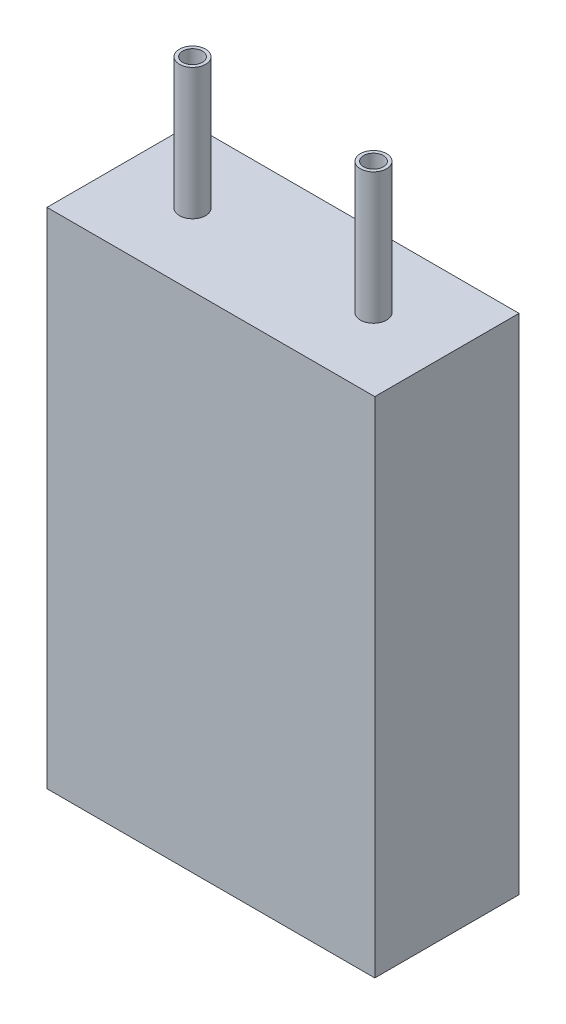
ISO-10303-21;
HEADER;
FILE_DESCRIPTION(('STEP AP214'),'2;1');
FILE_NAME('part.step','',(''),(''),'','','');
FILE_SCHEMA(('AUTOMOTIVE_DESIGN { 1 0 10303 214 1 1 1 1 }'));
ENDSEC;
DATA;
#1=APPLICATION_CONTEXT('core data for automotive mechanical design processes');
#2=APPLICATION_PROTOCOL_DEFINITION('international standard','automotive_design',2000,#1);
#3=PRODUCT_CONTEXT('',#1,'mechanical');
#4=PRODUCT('Part','Part','',(#3));
#5=PRODUCT_RELATED_PRODUCT_CATEGORY('part','',(#4));
#6=PRODUCT_DEFINITION_FORMATION('','',#4);
#7=PRODUCT_DEFINITION_CONTEXT('part definition',#1,'design');
#8=PRODUCT_DEFINITION('design','',#6,#7);
#9=PRODUCT_DEFINITION_SHAPE('','',#8);
#10=(LENGTH_UNIT() NAMED_UNIT(*) SI_UNIT(.MILLI.,.METRE.));
#11=(NAMED_UNIT(*) PLANE_ANGLE_UNIT() SI_UNIT($,.RADIAN.));
#12=(NAMED_UNIT(*) SI_UNIT($,.STERADIAN.) SOLID_ANGLE_UNIT());
#13=UNCERTAINTY_MEASURE_WITH_UNIT(LENGTH_MEASURE(1.E-05),#10,'distance_accuracy_value','');
#14=(GEOMETRIC_REPRESENTATION_CONTEXT(3) GLOBAL_UNCERTAINTY_ASSIGNED_CONTEXT((#13)) GLOBAL_UNIT_ASSIGNED_CONTEXT((#10,
#11,#12)) REPRESENTATION_CONTEXT('',''));
#15=CARTESIAN_POINT('',(0.,0.,0.));
#16=DIRECTION('',(0.,0.,1.));
#17=DIRECTION('',(1.,0.,0.));
#18=AXIS2_PLACEMENT_3D('',#15,#16,#17);
#19=CARTESIAN_POINT('',(0.,97.536,0.));
#20=DIRECTION('',(1.,0.,0.));
#21=DIRECTION('',(0.,0.,-1.));
#22=AXIS2_PLACEMENT_3D('',#19,#20,#21);
#23=PLANE('',#22);
#24=DIRECTION('',(0.,0.,1.));
#25=VECTOR('',#24,1.);
#26=CARTESIAN_POINT('',(0.,0.,0.));
#27=LINE('',#26,#25);
#28=CARTESIAN_POINT('',(0.,0.,0.));
#29=VERTEX_POINT('',#28);
#30=CARTESIAN_POINT('',(0.,0.,27.94));
#31=VERTEX_POINT('',#30);
#32=EDGE_CURVE('E111',#29,#31,#27,.T.);
#33=ORIENTED_EDGE('',*,*,#32,.T.);
#34=DIRECTION('',(0.,-1.,0.));
#35=VECTOR('',#34,1.);
#36=CARTESIAN_POINT('',(0.,97.536,27.94));
#37=LINE('',#36,#35);
#38=CARTESIAN_POINT('',(0.,97.536,27.94));
#39=VERTEX_POINT('',#38);
#40=EDGE_CURVE('E100',#39,#31,#37,.T.);
#41=ORIENTED_EDGE('',*,*,#40,.F.);
#42=DIRECTION('',(0.,0.,1.));
#43=VECTOR('',#42,1.);
#44=CARTESIAN_POINT('',(0.,97.536,0.));
#45=LINE('',#44,#43);
#46=CARTESIAN_POINT('',(0.,97.536,0.));
#47=VERTEX_POINT('',#46);
#48=EDGE_CURVE('E92',#47,#39,#45,.T.);
#49=ORIENTED_EDGE('',*,*,#48,.F.);
#50=DIRECTION('',(0.,-1.,0.));
#51=VECTOR('',#50,1.);
#52=CARTESIAN_POINT('',(0.,97.536,0.));
#53=LINE('',#52,#51);
#54=EDGE_CURVE('E107',#47,#29,#53,.T.);
#55=ORIENTED_EDGE('',*,*,#54,.T.);
#56=EDGE_LOOP('',(#33,#41,#49,#55));
#57=FACE_BOUND('',#56,.T.);
#58=ADVANCED_FACE('F39',(#57),#23,.F.);
#59=CARTESIAN_POINT('',(0.,97.536,27.94));
#60=DIRECTION('',(0.,0.,-1.));
#61=DIRECTION('',(-1.,0.,0.));
#62=AXIS2_PLACEMENT_3D('',#59,#60,#61);
#63=PLANE('',#62);
#64=DIRECTION('',(1.,0.,0.));
#65=VECTOR('',#64,1.);
#66=CARTESIAN_POINT('',(0.,0.,27.94));
#67=LINE('',#66,#65);
#68=CARTESIAN_POINT('',(63.5,0.,27.94));
#69=VERTEX_POINT('',#68);
#70=EDGE_CURVE('E98',#31,#69,#67,.T.);
#71=ORIENTED_EDGE('',*,*,#70,.T.);
#72=DIRECTION('',(0.,-1.,0.));
#73=VECTOR('',#72,1.);
#74=CARTESIAN_POINT('',(63.5,97.536,27.94));
#75=LINE('',#74,#73);
#76=CARTESIAN_POINT('',(63.5,97.536,27.94));
#77=VERTEX_POINT('',#76);
#78=EDGE_CURVE('E96',#77,#69,#75,.T.);
#79=ORIENTED_EDGE('',*,*,#78,.F.);
#80=DIRECTION('',(1.,0.,0.));
#81=VECTOR('',#80,1.);
#82=CARTESIAN_POINT('',(0.,97.536,27.94));
#83=LINE('',#82,#81);
#84=EDGE_CURVE('E87',#39,#77,#83,.T.);
#85=ORIENTED_EDGE('',*,*,#84,.F.);
#86=ORIENTED_EDGE('',*,*,#40,.T.);
#87=EDGE_LOOP('',(#71,#79,#85,#86));
#88=FACE_BOUND('',#87,.T.);
#89=ADVANCED_FACE('F97',(#88),#63,.F.);
#90=CARTESIAN_POINT('',(63.5,97.536,0.));
#91=DIRECTION('',(-1.,0.,0.));
#92=DIRECTION('',(0.,0.,1.));
#93=AXIS2_PLACEMENT_3D('',#90,#91,#92);
#94=PLANE('',#93);
#95=DIRECTION('',(0.,0.,-1.));
#96=VECTOR('',#95,1.);
#97=CARTESIAN_POINT('',(63.5,0.,0.));
#98=LINE('',#97,#96);
#99=CARTESIAN_POINT('',(63.5,0.,0.));
#100=VERTEX_POINT('',#99);
#101=EDGE_CURVE('E73',#69,#100,#98,.T.);
#102=ORIENTED_EDGE('',*,*,#101,.T.);
#103=DIRECTION('',(0.,-1.,0.));
#104=VECTOR('',#103,1.);
#105=CARTESIAN_POINT('',(63.5,97.536,0.));
#106=LINE('',#105,#104);
#107=CARTESIAN_POINT('',(63.5,97.536,0.));
#108=VERTEX_POINT('',#107);
#109=EDGE_CURVE('E101',#108,#100,#106,.T.);
#110=ORIENTED_EDGE('',*,*,#109,.F.);
#111=DIRECTION('',(0.,0.,-1.));
#112=VECTOR('',#111,1.);
#113=CARTESIAN_POINT('',(63.5,97.536,0.));
#114=LINE('',#113,#112);
#115=EDGE_CURVE('E90',#77,#108,#114,.T.);
#116=ORIENTED_EDGE('',*,*,#115,.F.);
#117=ORIENTED_EDGE('',*,*,#78,.T.);
#118=EDGE_LOOP('',(#102,#110,#116,#117));
#119=FACE_BOUND('',#118,.T.);
#120=ADVANCED_FACE('F103',(#119),#94,.F.);
#121=CARTESIAN_POINT('',(0.,97.536,0.));
#122=DIRECTION('',(0.,0.,1.));
#123=DIRECTION('',(1.,0.,0.));
#124=AXIS2_PLACEMENT_3D('',#121,#122,#123);
#125=PLANE('',#124);
#126=DIRECTION('',(-1.,0.,0.));
#127=VECTOR('',#126,1.);
#128=CARTESIAN_POINT('',(0.,0.,0.));
#129=LINE('',#128,#127);
#130=EDGE_CURVE('E79',#100,#29,#129,.T.);
#131=ORIENTED_EDGE('',*,*,#130,.T.);
#132=ORIENTED_EDGE('',*,*,#54,.F.);
#133=DIRECTION('',(-1.,0.,0.));
#134=VECTOR('',#133,1.);
#135=CARTESIAN_POINT('',(0.,97.536,0.));
#136=LINE('',#135,#134);
#137=EDGE_CURVE('E56',#108,#47,#136,.T.);
#138=ORIENTED_EDGE('',*,*,#137,.F.);
#139=ORIENTED_EDGE('',*,*,#109,.T.);
#140=EDGE_LOOP('',(#131,#132,#138,#139));
#141=FACE_BOUND('',#140,.T.);
#142=ADVANCED_FACE('F152',(#141),#125,.F.);
#143=CARTESIAN_POINT('',(0.,97.536,0.));
#144=DIRECTION('',(0.,1.,0.));
#145=DIRECTION('',(0.,0.,1.));
#146=AXIS2_PLACEMENT_3D('',#143,#144,#145);
#147=PLANE('',#146);
#148=CARTESIAN_POINT('',(49.276,97.536,13.97));
#149=DIRECTION('',(0.,1.,0.));
#150=DIRECTION('',(0.,0.,1.));
#151=AXIS2_PLACEMENT_3D('',#148,#149,#150);
#152=CIRCLE('',#151,2.54);
#153=CARTESIAN_POINT('',(49.276,97.536,16.51));
#154=VERTEX_POINT('',#153);
#155=EDGE_CURVE('E254',#154,#154,#152,.T.);
#156=ORIENTED_EDGE('',*,*,#155,.F.);
#157=EDGE_LOOP('',(#156));
#158=FACE_BOUND('',#157,.T.);
#159=CARTESIAN_POINT('',(14.224,97.536,13.97));
#160=DIRECTION('',(0.,1.,0.));
#161=DIRECTION('',(0.,0.,1.));
#162=AXIS2_PLACEMENT_3D('',#159,#160,#161);
#163=CIRCLE('',#162,2.54);
#164=CARTESIAN_POINT('',(14.224,97.536,16.51));
#165=VERTEX_POINT('',#164);
#166=EDGE_CURVE('E268',#165,#165,#163,.T.);
#167=ORIENTED_EDGE('',*,*,#166,.F.);
#168=EDGE_LOOP('',(#167));
#169=FACE_BOUND('',#168,.T.);
#170=ORIENTED_EDGE('',*,*,#48,.T.);
#171=ORIENTED_EDGE('',*,*,#84,.T.);
#172=ORIENTED_EDGE('',*,*,#115,.T.);
#173=ORIENTED_EDGE('',*,*,#137,.T.);
#174=EDGE_LOOP('',(#170,#171,#172,#173));
#175=FACE_BOUND('',#174,.T.);
#176=ADVANCED_FACE('F88',(#158,#169,#175),#147,.T.);
#177=CARTESIAN_POINT('',(0.,0.,0.));
#178=DIRECTION('',(0.,1.,0.));
#179=DIRECTION('',(0.,0.,1.));
#180=AXIS2_PLACEMENT_3D('',#177,#178,#179);
#181=PLANE('',#180);
#182=ORIENTED_EDGE('',*,*,#32,.F.);
#183=ORIENTED_EDGE('',*,*,#130,.F.);
#184=ORIENTED_EDGE('',*,*,#101,.F.);
#185=ORIENTED_EDGE('',*,*,#70,.F.);
#186=EDGE_LOOP('',(#182,#183,#184,#185));
#187=FACE_BOUND('',#186,.T.);
#188=ADVANCED_FACE('F151',(#187),#181,.F.);
#189=CARTESIAN_POINT('',(14.224,122.936,13.97));
#190=DIRECTION('',(0.,1.,0.));
#191=DIRECTION('',(0.,0.,1.));
#192=AXIS2_PLACEMENT_3D('',#189,#190,#191);
#193=PLANE('',#192);
#194=CARTESIAN_POINT('',(14.224,122.936,13.97));
#195=DIRECTION('',(0.,1.,0.));
#196=DIRECTION('',(0.,0.,1.));
#197=AXIS2_PLACEMENT_3D('',#194,#195,#196);
#198=CIRCLE('',#197,2.54);
#199=CARTESIAN_POINT('',(14.224,122.936,16.51));
#200=VERTEX_POINT('',#199);
#201=EDGE_CURVE('E115',#200,#200,#198,.T.);
#202=ORIENTED_EDGE('',*,*,#201,.T.);
#203=EDGE_LOOP('',(#202));
#204=FACE_BOUND('',#203,.T.);
#205=CARTESIAN_POINT('',(14.224,122.936,13.97));
#206=DIRECTION('',(0.,1.,0.));
#207=DIRECTION('',(0.,0.,1.));
#208=AXIS2_PLACEMENT_3D('',#205,#206,#207);
#209=CIRCLE('',#208,1.905);
#210=CARTESIAN_POINT('',(14.224,122.936,15.875));
#211=VERTEX_POINT('',#210);
#212=EDGE_CURVE('E263',#211,#211,#209,.T.);
#213=ORIENTED_EDGE('',*,*,#212,.F.);
#214=EDGE_LOOP('',(#213));
#215=FACE_BOUND('',#214,.T.);
#216=ADVANCED_FACE('F165',(#204,#215),#193,.T.);
#217=CARTESIAN_POINT('',(14.224,122.936,13.97));
#218=DIRECTION('',(0.,-1.,0.));
#219=DIRECTION('',(0.,0.,-1.));
#220=AXIS2_PLACEMENT_3D('',#217,#218,#219);
#221=CYLINDRICAL_SURFACE('',#220,2.54);
#222=ORIENTED_EDGE('',*,*,#201,.F.);
#223=EDGE_LOOP('',(#222));
#224=FACE_BOUND('',#223,.T.);
#225=ORIENTED_EDGE('',*,*,#166,.T.);
#226=EDGE_LOOP('',(#225));
#227=FACE_BOUND('',#226,.T.);
#228=ADVANCED_FACE('F145',(#224,#227),#221,.T.);
#229=CARTESIAN_POINT('',(14.224,122.936,13.97));
#230=DIRECTION('',(0.,-1.,0.));
#231=DIRECTION('',(0.,0.,-1.));
#232=AXIS2_PLACEMENT_3D('',#229,#230,#231);
#233=CYLINDRICAL_SURFACE('',#232,1.905);
#234=ORIENTED_EDGE('',*,*,#212,.T.);
#235=EDGE_LOOP('',(#234));
#236=FACE_BOUND('',#235,.T.);
#237=CARTESIAN_POINT('',(14.224,97.536,13.97));
#238=DIRECTION('',(0.,1.,0.));
#239=DIRECTION('',(0.,0.,1.));
#240=AXIS2_PLACEMENT_3D('',#237,#238,#239);
#241=CIRCLE('',#240,1.905);
#242=CARTESIAN_POINT('',(14.224,97.536,15.875));
#243=VERTEX_POINT('',#242);
#244=EDGE_CURVE('E48',#243,#243,#241,.F.);
#245=ORIENTED_EDGE('',*,*,#244,.T.);
#246=EDGE_LOOP('',(#245));
#247=FACE_BOUND('',#246,.T.);
#248=ADVANCED_FACE('F131',(#236,#247),#233,.F.);
#249=ORIENTED_EDGE('',*,*,#244,.F.);
#250=EDGE_LOOP('',(#249));
#251=FACE_BOUND('',#250,.T.);
#252=ADVANCED_FACE('F133',(#251),#147,.T.);
#253=CARTESIAN_POINT('',(49.276,122.936,13.97));
#254=DIRECTION('',(0.,1.,0.));
#255=DIRECTION('',(0.,0.,1.));
#256=AXIS2_PLACEMENT_3D('',#253,#254,#255);
#257=PLANE('',#256);
#258=CARTESIAN_POINT('',(49.276,122.936,13.97));
#259=DIRECTION('',(0.,1.,0.));
#260=DIRECTION('',(0.,0.,1.));
#261=AXIS2_PLACEMENT_3D('',#258,#259,#260);
#262=CIRCLE('',#261,2.54);
#263=CARTESIAN_POINT('',(49.276,122.936,16.51));
#264=VERTEX_POINT('',#263);
#265=EDGE_CURVE('E258',#264,#264,#262,.T.);
#266=ORIENTED_EDGE('',*,*,#265,.T.);
#267=EDGE_LOOP('',(#266));
#268=FACE_BOUND('',#267,.T.);
#269=CARTESIAN_POINT('',(49.276,122.936,13.97));
#270=DIRECTION('',(0.,1.,0.));
#271=DIRECTION('',(0.,0.,1.));
#272=AXIS2_PLACEMENT_3D('',#269,#270,#271);
#273=CIRCLE('',#272,1.905);
#274=CARTESIAN_POINT('',(49.276,122.936,15.875));
#275=VERTEX_POINT('',#274);
#276=EDGE_CURVE('E250',#275,#275,#273,.T.);
#277=ORIENTED_EDGE('',*,*,#276,.F.);
#278=EDGE_LOOP('',(#277));
#279=FACE_BOUND('',#278,.T.);
#280=ADVANCED_FACE('F135',(#268,#279),#257,.T.);
#281=CARTESIAN_POINT('',(49.276,122.936,13.97));
#282=DIRECTION('',(0.,-1.,0.));
#283=DIRECTION('',(0.,0.,-1.));
#284=AXIS2_PLACEMENT_3D('',#281,#282,#283);
#285=CYLINDRICAL_SURFACE('',#284,2.54);
#286=ORIENTED_EDGE('',*,*,#265,.F.);
#287=EDGE_LOOP('',(#286));
#288=FACE_BOUND('',#287,.T.);
#289=ORIENTED_EDGE('',*,*,#155,.T.);
#290=EDGE_LOOP('',(#289));
#291=FACE_BOUND('',#290,.T.);
#292=ADVANCED_FACE('F142',(#288,#291),#285,.T.);
#293=CARTESIAN_POINT('',(49.276,122.936,13.97));
#294=DIRECTION('',(0.,-1.,0.));
#295=DIRECTION('',(0.,0.,-1.));
#296=AXIS2_PLACEMENT_3D('',#293,#294,#295);
#297=CYLINDRICAL_SURFACE('',#296,1.905);
#298=ORIENTED_EDGE('',*,*,#276,.T.);
#299=EDGE_LOOP('',(#298));
#300=FACE_BOUND('',#299,.T.);
#301=CARTESIAN_POINT('',(49.276,97.536,13.97));
#302=DIRECTION('',(0.,1.,0.));
#303=DIRECTION('',(0.,0.,1.));
#304=AXIS2_PLACEMENT_3D('',#301,#302,#303);
#305=CIRCLE('',#304,1.905);
#306=CARTESIAN_POINT('',(49.276,97.536,15.875));
#307=VERTEX_POINT('',#306);
#308=EDGE_CURVE('E11',#307,#307,#305,.F.);
#309=ORIENTED_EDGE('',*,*,#308,.T.);
#310=EDGE_LOOP('',(#309));
#311=FACE_BOUND('',#310,.T.);
#312=ADVANCED_FACE('F155',(#300,#311),#297,.F.);
#313=ORIENTED_EDGE('',*,*,#308,.F.);
#314=EDGE_LOOP('',(#313));
#315=FACE_BOUND('',#314,.T.);
#316=ADVANCED_FACE('F137',(#315),#147,.T.);
#317=CLOSED_SHELL('',(#58,#89,#120,#142,#176,#188,#216,#228,#248,#252,#280,#292,#312,#316));
#318=MANIFOLD_SOLID_BREP('B2',#317);
#319=ADVANCED_BREP_SHAPE_REPRESENTATION('',(#18,#318),#14);
#320=SHAPE_DEFINITION_REPRESENTATION(#9,#319);
ENDSEC;
END-ISO-10303-21;
